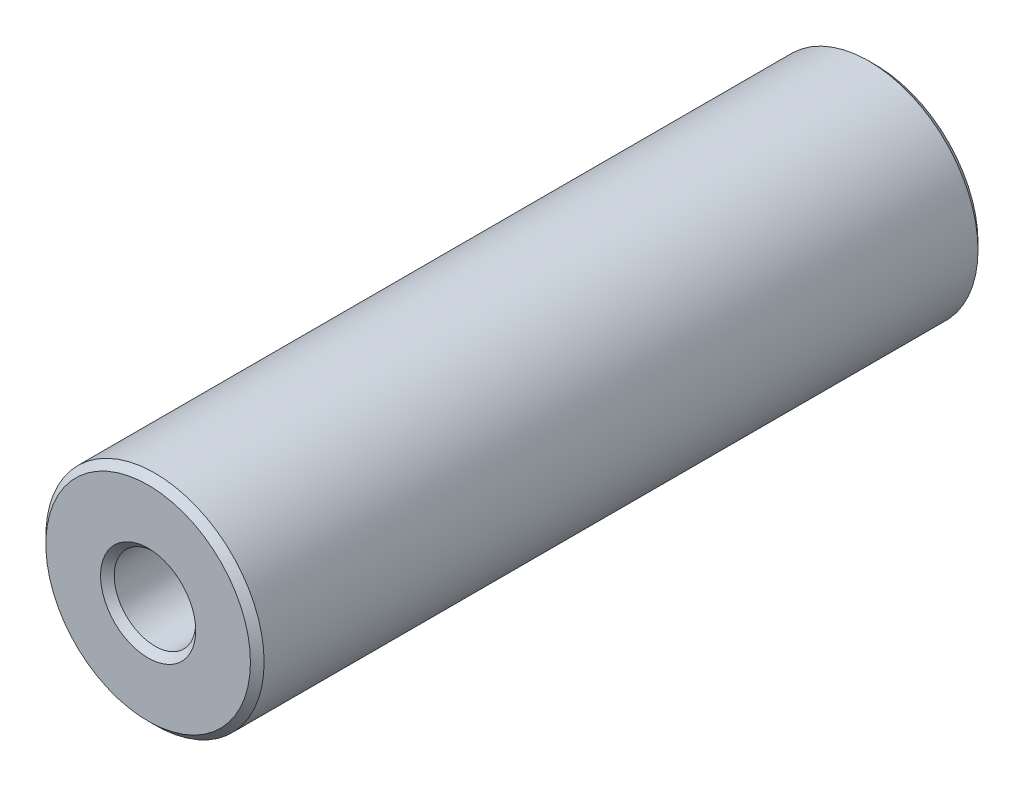
ISO-10303-21;
HEADER;
FILE_DESCRIPTION(('STEP AP214'),'2;1');
FILE_NAME('part.step','',(''),(''),'','','');
FILE_SCHEMA(('AUTOMOTIVE_DESIGN { 1 0 10303 214 1 1 1 1 }'));
ENDSEC;
DATA;
#1=APPLICATION_CONTEXT('core data for automotive mechanical design processes');
#2=APPLICATION_PROTOCOL_DEFINITION('international standard','automotive_design',2000,#1);
#3=PRODUCT_CONTEXT('',#1,'mechanical');
#4=PRODUCT('Part','Part','',(#3));
#5=PRODUCT_RELATED_PRODUCT_CATEGORY('part','',(#4));
#6=PRODUCT_DEFINITION_FORMATION('','',#4);
#7=PRODUCT_DEFINITION_CONTEXT('part definition',#1,'design');
#8=PRODUCT_DEFINITION('design','',#6,#7);
#9=PRODUCT_DEFINITION_SHAPE('','',#8);
#10=(LENGTH_UNIT() NAMED_UNIT(*) SI_UNIT(.MILLI.,.METRE.));
#11=(NAMED_UNIT(*) PLANE_ANGLE_UNIT() SI_UNIT($,.RADIAN.));
#12=(NAMED_UNIT(*) SI_UNIT($,.STERADIAN.) SOLID_ANGLE_UNIT());
#13=UNCERTAINTY_MEASURE_WITH_UNIT(LENGTH_MEASURE(1.E-05),#10,'distance_accuracy_value','');
#14=(GEOMETRIC_REPRESENTATION_CONTEXT(3) GLOBAL_UNCERTAINTY_ASSIGNED_CONTEXT((#13)) GLOBAL_UNIT_ASSIGNED_CONTEXT((#10,
#11,#12)) REPRESENTATION_CONTEXT('',''));
#15=CARTESIAN_POINT('',(0.,0.,0.));
#16=DIRECTION('',(0.,0.,1.));
#17=DIRECTION('',(1.,0.,0.));
#18=AXIS2_PLACEMENT_3D('',#15,#16,#17);
#19=CARTESIAN_POINT('',(0.,0.,-15.875));
#20=DIRECTION('',(0.,0.,1.));
#21=DIRECTION('',(1.,0.,0.));
#22=AXIS2_PLACEMENT_3D('',#19,#20,#21);
#23=CYLINDRICAL_SURFACE('',#22,4.7625);
#24=CARTESIAN_POINT('',(0.,0.,15.57655));
#25=DIRECTION('',(0.,0.,1.));
#26=DIRECTION('',(1.,0.,0.));
#27=AXIS2_PLACEMENT_3D('',#24,#25,#26);
#28=CIRCLE('',#27,4.7625);
#29=CARTESIAN_POINT('',(4.7625,0.,15.57655));
#30=VERTEX_POINT('',#29);
#31=EDGE_CURVE('E50',#30,#30,#28,.F.);
#32=ORIENTED_EDGE('',*,*,#31,.T.);
#33=EDGE_LOOP('',(#32));
#34=FACE_BOUND('',#33,.T.);
#35=CARTESIAN_POINT('',(0.,0.,-15.57655));
#36=DIRECTION('',(0.,0.,1.));
#37=DIRECTION('',(1.,0.,0.));
#38=AXIS2_PLACEMENT_3D('',#35,#36,#37);
#39=CIRCLE('',#38,4.7625);
#40=CARTESIAN_POINT('',(4.7625,0.,-15.57655));
#41=VERTEX_POINT('',#40);
#42=EDGE_CURVE('E53',#41,#41,#39,.T.);
#43=ORIENTED_EDGE('',*,*,#42,.T.);
#44=EDGE_LOOP('',(#43));
#45=FACE_BOUND('',#44,.T.);
#46=ADVANCED_FACE('F30',(#34,#45),#23,.T.);
#47=CARTESIAN_POINT('',(0.,0.,-15.875));
#48=DIRECTION('',(0.,0.,1.));
#49=DIRECTION('',(1.,0.,0.));
#50=AXIS2_PLACEMENT_3D('',#47,#48,#49);
#51=PLANE('',#50);
#52=CARTESIAN_POINT('',(0.,0.,-15.875));
#53=DIRECTION('',(0.,0.,1.));
#54=DIRECTION('',(1.,0.,0.));
#55=AXIS2_PLACEMENT_3D('',#52,#53,#54);
#56=CIRCLE('',#55,4.46405);
#57=CARTESIAN_POINT('',(4.46405,0.,-15.875));
#58=VERTEX_POINT('',#57);
#59=EDGE_CURVE('E41',#58,#58,#56,.F.);
#60=ORIENTED_EDGE('',*,*,#59,.T.);
#61=EDGE_LOOP('',(#60));
#62=FACE_BOUND('',#61,.T.);
#63=CARTESIAN_POINT('',(0.,0.,-15.875));
#64=DIRECTION('',(0.,0.,1.));
#65=DIRECTION('',(1.,0.,0.));
#66=AXIS2_PLACEMENT_3D('',#63,#64,#65);
#67=CIRCLE('',#66,2.07645);
#68=CARTESIAN_POINT('',(2.07645,0.,-15.875));
#69=VERTEX_POINT('',#68);
#70=EDGE_CURVE('E45',#69,#69,#67,.T.);
#71=ORIENTED_EDGE('',*,*,#70,.T.);
#72=EDGE_LOOP('',(#71));
#73=FACE_BOUND('',#72,.T.);
#74=ADVANCED_FACE('F78',(#62,#73),#51,.F.);
#75=CARTESIAN_POINT('',(0.,0.,-15.875));
#76=DIRECTION('',(0.,0.,1.));
#77=DIRECTION('',(1.,0.,0.));
#78=AXIS2_PLACEMENT_3D('',#75,#76,#77);
#79=CYLINDRICAL_SURFACE('',#78,1.778);
#80=CARTESIAN_POINT('',(0.,0.,15.57655));
#81=DIRECTION('',(0.,0.,1.));
#82=DIRECTION('',(1.,0.,0.));
#83=AXIS2_PLACEMENT_3D('',#80,#81,#82);
#84=CIRCLE('',#83,1.778);
#85=CARTESIAN_POINT('',(1.778,0.,15.57655));
#86=VERTEX_POINT('',#85);
#87=EDGE_CURVE('E10',#86,#86,#84,.T.);
#88=ORIENTED_EDGE('',*,*,#87,.T.);
#89=EDGE_LOOP('',(#88));
#90=FACE_BOUND('',#89,.T.);
#91=CARTESIAN_POINT('',(0.,0.,-15.57655));
#92=DIRECTION('',(0.,0.,1.));
#93=DIRECTION('',(1.,0.,0.));
#94=AXIS2_PLACEMENT_3D('',#91,#92,#93);
#95=CIRCLE('',#94,1.778);
#96=CARTESIAN_POINT('',(1.778,0.,-15.57655));
#97=VERTEX_POINT('',#96);
#98=EDGE_CURVE('E37',#97,#97,#95,.F.);
#99=ORIENTED_EDGE('',*,*,#98,.T.);
#100=EDGE_LOOP('',(#99));
#101=FACE_BOUND('',#100,.T.);
#102=ADVANCED_FACE('F84',(#90,#101),#79,.F.);
#103=CARTESIAN_POINT('',(0.,0.,15.875));
#104=DIRECTION('',(0.,0.,1.));
#105=DIRECTION('',(1.,0.,0.));
#106=AXIS2_PLACEMENT_3D('',#103,#104,#105);
#107=PLANE('',#106);
#108=CARTESIAN_POINT('',(0.,0.,15.875));
#109=DIRECTION('',(0.,0.,1.));
#110=DIRECTION('',(1.,0.,0.));
#111=AXIS2_PLACEMENT_3D('',#108,#109,#110);
#112=CIRCLE('',#111,4.46405);
#113=CARTESIAN_POINT('',(4.46405,0.,15.875));
#114=VERTEX_POINT('',#113);
#115=EDGE_CURVE('E56',#114,#114,#112,.T.);
#116=ORIENTED_EDGE('',*,*,#115,.T.);
#117=EDGE_LOOP('',(#116));
#118=FACE_BOUND('',#117,.T.);
#119=CARTESIAN_POINT('',(0.,0.,15.875));
#120=DIRECTION('',(0.,0.,1.));
#121=DIRECTION('',(1.,0.,0.));
#122=AXIS2_PLACEMENT_3D('',#119,#120,#121);
#123=CIRCLE('',#122,2.07645);
#124=CARTESIAN_POINT('',(2.07645,0.,15.875));
#125=VERTEX_POINT('',#124);
#126=EDGE_CURVE('E59',#125,#125,#123,.F.);
#127=ORIENTED_EDGE('',*,*,#126,.T.);
#128=EDGE_LOOP('',(#127));
#129=FACE_BOUND('',#128,.T.);
#130=ADVANCED_FACE('F63',(#118,#129),#107,.T.);
#131=CARTESIAN_POINT('',(0.,0.,15.875));
#132=DIRECTION('',(0.,0.,-1.));
#133=DIRECTION('',(-1.,0.,0.));
#134=AXIS2_PLACEMENT_3D('',#131,#132,#133);
#135=CONICAL_SURFACE('',#134,4.46405,0.785398163397438);
#136=ORIENTED_EDGE('',*,*,#31,.F.);
#137=EDGE_LOOP('',(#136));
#138=FACE_BOUND('',#137,.T.);
#139=ORIENTED_EDGE('',*,*,#115,.F.);
#140=EDGE_LOOP('',(#139));
#141=FACE_BOUND('',#140,.T.);
#142=ADVANCED_FACE('F74',(#138,#141),#135,.T.);
#143=CARTESIAN_POINT('',(0.,0.,-15.57655));
#144=DIRECTION('',(0.,0.,1.));
#145=DIRECTION('',(1.,0.,0.));
#146=AXIS2_PLACEMENT_3D('',#143,#144,#145);
#147=CONICAL_SURFACE('',#146,4.7625,0.78539816339745);
#148=ORIENTED_EDGE('',*,*,#59,.F.);
#149=EDGE_LOOP('',(#148));
#150=FACE_BOUND('',#149,.T.);
#151=ORIENTED_EDGE('',*,*,#42,.F.);
#152=EDGE_LOOP('',(#151));
#153=FACE_BOUND('',#152,.T.);
#154=ADVANCED_FACE('F68',(#150,#153),#147,.T.);
#155=CARTESIAN_POINT('',(0.,0.,15.57655));
#156=DIRECTION('',(0.,0.,1.));
#157=DIRECTION('',(1.,0.,0.));
#158=AXIS2_PLACEMENT_3D('',#155,#156,#157);
#159=CONICAL_SURFACE('',#158,1.778,0.785398163397445);
#160=ORIENTED_EDGE('',*,*,#126,.F.);
#161=EDGE_LOOP('',(#160));
#162=FACE_BOUND('',#161,.T.);
#163=ORIENTED_EDGE('',*,*,#87,.F.);
#164=EDGE_LOOP('',(#163));
#165=FACE_BOUND('',#164,.T.);
#166=ADVANCED_FACE('F65',(#162,#165),#159,.F.);
#167=CARTESIAN_POINT('',(0.,0.,-15.875));
#168=DIRECTION('',(0.,0.,-1.));
#169=DIRECTION('',(-1.,0.,0.));
#170=AXIS2_PLACEMENT_3D('',#167,#168,#169);
#171=CONICAL_SURFACE('',#170,2.07645,0.78539816339744);
#172=ORIENTED_EDGE('',*,*,#98,.F.);
#173=EDGE_LOOP('',(#172));
#174=FACE_BOUND('',#173,.T.);
#175=ORIENTED_EDGE('',*,*,#70,.F.);
#176=EDGE_LOOP('',(#175));
#177=FACE_BOUND('',#176,.T.);
#178=ADVANCED_FACE('F32',(#174,#177),#171,.F.);
#179=CLOSED_SHELL('',(#46,#74,#102,#130,#142,#154,#166,#178));
#180=MANIFOLD_SOLID_BREP('B2',#179);
#181=ADVANCED_BREP_SHAPE_REPRESENTATION('',(#18,#180),#14);
#182=SHAPE_DEFINITION_REPRESENTATION(#9,#181);
ENDSEC;
END-ISO-10303-21;
